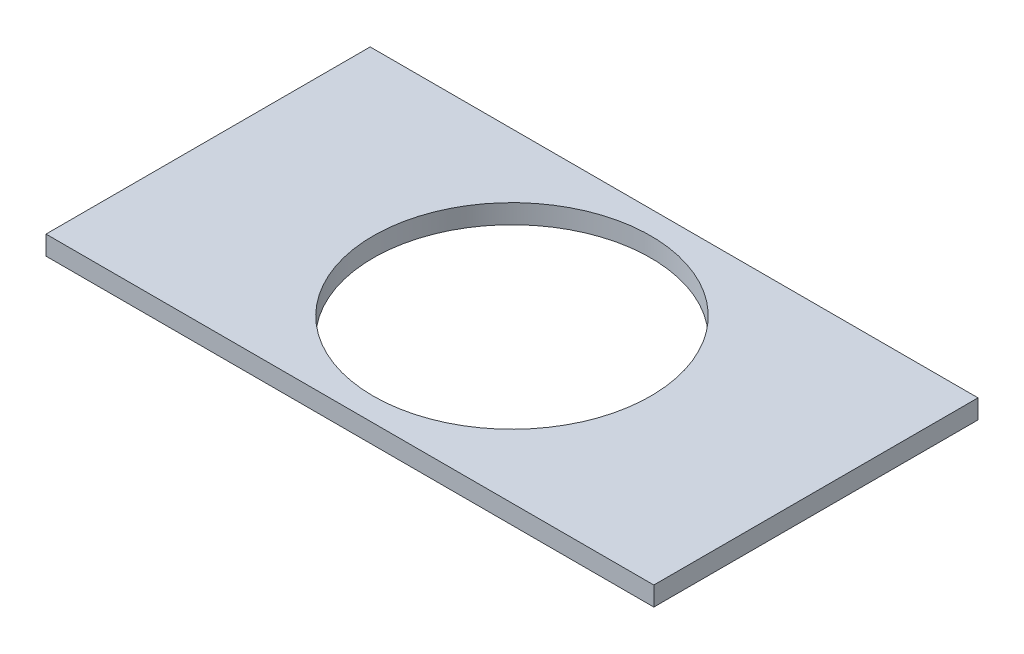
ISO-10303-21;
HEADER;
FILE_DESCRIPTION(('STEP AP214'),'2;1');
FILE_NAME('part.step','',(''),(''),'','','');
FILE_SCHEMA(('AUTOMOTIVE_DESIGN { 1 0 10303 214 1 1 1 1 }'));
ENDSEC;
DATA;
#1=APPLICATION_CONTEXT('core data for automotive mechanical design processes');
#2=APPLICATION_PROTOCOL_DEFINITION('international standard','automotive_design',2000,#1);
#3=PRODUCT_CONTEXT('',#1,'mechanical');
#4=PRODUCT('Part','Part','',(#3));
#5=PRODUCT_RELATED_PRODUCT_CATEGORY('part','',(#4));
#6=PRODUCT_DEFINITION_FORMATION('','',#4);
#7=PRODUCT_DEFINITION_CONTEXT('part definition',#1,'design');
#8=PRODUCT_DEFINITION('design','',#6,#7);
#9=PRODUCT_DEFINITION_SHAPE('','',#8);
#10=(LENGTH_UNIT() NAMED_UNIT(*) SI_UNIT(.MILLI.,.METRE.));
#11=(NAMED_UNIT(*) PLANE_ANGLE_UNIT() SI_UNIT($,.RADIAN.));
#12=(NAMED_UNIT(*) SI_UNIT($,.STERADIAN.) SOLID_ANGLE_UNIT());
#13=UNCERTAINTY_MEASURE_WITH_UNIT(LENGTH_MEASURE(1.E-05),#10,'distance_accuracy_value','');
#14=(GEOMETRIC_REPRESENTATION_CONTEXT(3) GLOBAL_UNCERTAINTY_ASSIGNED_CONTEXT((#13)) GLOBAL_UNIT_ASSIGNED_CONTEXT((#10,
#11,#12)) REPRESENTATION_CONTEXT('',''));
#15=CARTESIAN_POINT('',(0.,0.,0.));
#16=DIRECTION('',(0.,0.,1.));
#17=DIRECTION('',(1.,0.,0.));
#18=AXIS2_PLACEMENT_3D('',#15,#16,#17);
#19=CARTESIAN_POINT('',(47.625,3.,-25.4));
#20=DIRECTION('',(-1.,0.,0.));
#21=DIRECTION('',(0.,0.,1.));
#22=AXIS2_PLACEMENT_3D('',#19,#20,#21);
#23=PLANE('',#22);
#24=DIRECTION('',(0.,0.,-1.));
#25=VECTOR('',#24,1.);
#26=CARTESIAN_POINT('',(47.625,0.,-25.4));
#27=LINE('',#26,#25);
#28=CARTESIAN_POINT('',(47.625,0.,25.4));
#29=VERTEX_POINT('',#28);
#30=CARTESIAN_POINT('',(47.625,0.,-25.4));
#31=VERTEX_POINT('',#30);
#32=EDGE_CURVE('E113',#29,#31,#27,.T.);
#33=ORIENTED_EDGE('',*,*,#32,.T.);
#34=DIRECTION('',(0.,-1.,0.));
#35=VECTOR('',#34,1.);
#36=CARTESIAN_POINT('',(47.625,3.,-25.4));
#37=LINE('',#36,#35);
#38=CARTESIAN_POINT('',(47.625,3.,-25.4));
#39=VERTEX_POINT('',#38);
#40=EDGE_CURVE('E11',#39,#31,#37,.T.);
#41=ORIENTED_EDGE('',*,*,#40,.F.);
#42=DIRECTION('',(0.,0.,-1.));
#43=VECTOR('',#42,1.);
#44=CARTESIAN_POINT('',(47.625,3.,-25.4));
#45=LINE('',#44,#43);
#46=CARTESIAN_POINT('',(47.625,3.,25.4));
#47=VERTEX_POINT('',#46);
#48=EDGE_CURVE('E97',#47,#39,#45,.T.);
#49=ORIENTED_EDGE('',*,*,#48,.F.);
#50=DIRECTION('',(0.,-1.,0.));
#51=VECTOR('',#50,1.);
#52=CARTESIAN_POINT('',(47.625,3.,25.4));
#53=LINE('',#52,#51);
#54=EDGE_CURVE('E109',#47,#29,#53,.T.);
#55=ORIENTED_EDGE('',*,*,#54,.T.);
#56=EDGE_LOOP('',(#33,#41,#49,#55));
#57=FACE_BOUND('',#56,.T.);
#58=ADVANCED_FACE('F45',(#57),#23,.F.);
#59=CARTESIAN_POINT('',(-47.625,3.,-25.4));
#60=DIRECTION('',(0.,0.,1.));
#61=DIRECTION('',(1.,0.,0.));
#62=AXIS2_PLACEMENT_3D('',#59,#60,#61);
#63=PLANE('',#62);
#64=DIRECTION('',(-1.,0.,0.));
#65=VECTOR('',#64,1.);
#66=CARTESIAN_POINT('',(-47.625,0.,-25.4));
#67=LINE('',#66,#65);
#68=CARTESIAN_POINT('',(-47.625,0.,-25.4));
#69=VERTEX_POINT('',#68);
#70=EDGE_CURVE('E102',#31,#69,#67,.T.);
#71=ORIENTED_EDGE('',*,*,#70,.T.);
#72=DIRECTION('',(0.,-1.,0.));
#73=VECTOR('',#72,1.);
#74=CARTESIAN_POINT('',(-47.625,3.,-25.4));
#75=LINE('',#74,#73);
#76=CARTESIAN_POINT('',(-47.625,3.,-25.4));
#77=VERTEX_POINT('',#76);
#78=EDGE_CURVE('E54',#77,#69,#75,.T.);
#79=ORIENTED_EDGE('',*,*,#78,.F.);
#80=DIRECTION('',(-1.,0.,0.));
#81=VECTOR('',#80,1.);
#82=CARTESIAN_POINT('',(-47.625,3.,-25.4));
#83=LINE('',#82,#81);
#84=EDGE_CURVE('E92',#39,#77,#83,.T.);
#85=ORIENTED_EDGE('',*,*,#84,.F.);
#86=ORIENTED_EDGE('',*,*,#40,.T.);
#87=EDGE_LOOP('',(#71,#79,#85,#86));
#88=FACE_BOUND('',#87,.T.);
#89=ADVANCED_FACE('F101',(#88),#63,.F.);
#90=CARTESIAN_POINT('',(-47.625,3.,-25.4));
#91=DIRECTION('',(1.,0.,0.));
#92=DIRECTION('',(0.,0.,-1.));
#93=AXIS2_PLACEMENT_3D('',#90,#91,#92);
#94=PLANE('',#93);
#95=DIRECTION('',(0.,0.,1.));
#96=VECTOR('',#95,1.);
#97=CARTESIAN_POINT('',(-47.625,0.,-25.4));
#98=LINE('',#97,#96);
#99=CARTESIAN_POINT('',(-47.625,0.,25.4));
#100=VERTEX_POINT('',#99);
#101=EDGE_CURVE('E79',#69,#100,#98,.T.);
#102=ORIENTED_EDGE('',*,*,#101,.T.);
#103=DIRECTION('',(0.,-1.,0.));
#104=VECTOR('',#103,1.);
#105=CARTESIAN_POINT('',(-47.625,3.,25.4));
#106=LINE('',#105,#104);
#107=CARTESIAN_POINT('',(-47.625,3.,25.4));
#108=VERTEX_POINT('',#107);
#109=EDGE_CURVE('E104',#108,#100,#106,.T.);
#110=ORIENTED_EDGE('',*,*,#109,.F.);
#111=DIRECTION('',(0.,0.,1.));
#112=VECTOR('',#111,1.);
#113=CARTESIAN_POINT('',(-47.625,3.,-25.4));
#114=LINE('',#113,#112);
#115=EDGE_CURVE('E95',#77,#108,#114,.T.);
#116=ORIENTED_EDGE('',*,*,#115,.F.);
#117=ORIENTED_EDGE('',*,*,#78,.T.);
#118=EDGE_LOOP('',(#102,#110,#116,#117));
#119=FACE_BOUND('',#118,.T.);
#120=ADVANCED_FACE('F105',(#119),#94,.F.);
#121=CARTESIAN_POINT('',(-47.625,3.,25.4));
#122=DIRECTION('',(0.,0.,-1.));
#123=DIRECTION('',(-1.,0.,0.));
#124=AXIS2_PLACEMENT_3D('',#121,#122,#123);
#125=PLANE('',#124);
#126=DIRECTION('',(1.,0.,0.));
#127=VECTOR('',#126,1.);
#128=CARTESIAN_POINT('',(-47.625,0.,25.4));
#129=LINE('',#128,#127);
#130=EDGE_CURVE('E85',#100,#29,#129,.T.);
#131=ORIENTED_EDGE('',*,*,#130,.T.);
#132=ORIENTED_EDGE('',*,*,#54,.F.);
#133=DIRECTION('',(1.,0.,0.));
#134=VECTOR('',#133,1.);
#135=CARTESIAN_POINT('',(-47.625,3.,25.4));
#136=LINE('',#135,#134);
#137=EDGE_CURVE('E62',#108,#47,#136,.T.);
#138=ORIENTED_EDGE('',*,*,#137,.F.);
#139=ORIENTED_EDGE('',*,*,#109,.T.);
#140=EDGE_LOOP('',(#131,#132,#138,#139));
#141=FACE_BOUND('',#140,.T.);
#142=ADVANCED_FACE('F127',(#141),#125,.F.);
#143=CARTESIAN_POINT('',(0.,3.,0.));
#144=DIRECTION('',(0.,1.,0.));
#145=DIRECTION('',(0.,0.,1.));
#146=AXIS2_PLACEMENT_3D('',#143,#144,#145);
#147=PLANE('',#146);
#148=CARTESIAN_POINT('',(0.,3.,0.));
#149=DIRECTION('',(0.,1.,0.));
#150=DIRECTION('',(0.,0.,1.));
#151=AXIS2_PLACEMENT_3D('',#148,#149,#150);
#152=CIRCLE('',#151,21.75);
#153=CARTESIAN_POINT('',(0.,3.,21.75));
#154=VERTEX_POINT('',#153);
#155=EDGE_CURVE('E117',#154,#154,#152,.T.);
#156=ORIENTED_EDGE('',*,*,#155,.F.);
#157=EDGE_LOOP('',(#156));
#158=FACE_BOUND('',#157,.T.);
#159=ORIENTED_EDGE('',*,*,#48,.T.);
#160=ORIENTED_EDGE('',*,*,#84,.T.);
#161=ORIENTED_EDGE('',*,*,#115,.T.);
#162=ORIENTED_EDGE('',*,*,#137,.T.);
#163=EDGE_LOOP('',(#159,#160,#161,#162));
#164=FACE_BOUND('',#163,.T.);
#165=ADVANCED_FACE('F93',(#158,#164),#147,.T.);
#166=CARTESIAN_POINT('',(0.,0.,0.));
#167=DIRECTION('',(0.,1.,0.));
#168=DIRECTION('',(0.,0.,1.));
#169=AXIS2_PLACEMENT_3D('',#166,#167,#168);
#170=PLANE('',#169);
#171=CARTESIAN_POINT('',(0.,0.,0.));
#172=DIRECTION('',(0.,1.,0.));
#173=DIRECTION('',(0.,0.,1.));
#174=AXIS2_PLACEMENT_3D('',#171,#172,#173);
#175=CIRCLE('',#174,21.75);
#176=CARTESIAN_POINT('',(0.,0.,21.75));
#177=VERTEX_POINT('',#176);
#178=EDGE_CURVE('E137',#177,#177,#175,.T.);
#179=ORIENTED_EDGE('',*,*,#178,.T.);
#180=EDGE_LOOP('',(#179));
#181=FACE_BOUND('',#180,.T.);
#182=ORIENTED_EDGE('',*,*,#32,.F.);
#183=ORIENTED_EDGE('',*,*,#130,.F.);
#184=ORIENTED_EDGE('',*,*,#101,.F.);
#185=ORIENTED_EDGE('',*,*,#70,.F.);
#186=EDGE_LOOP('',(#182,#183,#184,#185));
#187=FACE_BOUND('',#186,.T.);
#188=ADVANCED_FACE('F130',(#181,#187),#170,.F.);
#189=CARTESIAN_POINT('',(0.,0.,0.));
#190=DIRECTION('',(0.,1.,0.));
#191=DIRECTION('',(0.,0.,1.));
#192=AXIS2_PLACEMENT_3D('',#189,#190,#191);
#193=CYLINDRICAL_SURFACE('',#192,21.75);
#194=ORIENTED_EDGE('',*,*,#155,.T.);
#195=EDGE_LOOP('',(#194));
#196=FACE_BOUND('',#195,.T.);
#197=ORIENTED_EDGE('',*,*,#178,.F.);
#198=EDGE_LOOP('',(#197));
#199=FACE_BOUND('',#198,.T.);
#200=ADVANCED_FACE('F143',(#196,#199),#193,.F.);
#201=CLOSED_SHELL('',(#58,#89,#120,#142,#165,#188,#200));
#202=MANIFOLD_SOLID_BREP('B2',#201);
#203=ADVANCED_BREP_SHAPE_REPRESENTATION('',(#18,#202),#14);
#204=SHAPE_DEFINITION_REPRESENTATION(#9,#203);
ENDSEC;
END-ISO-10303-21;
